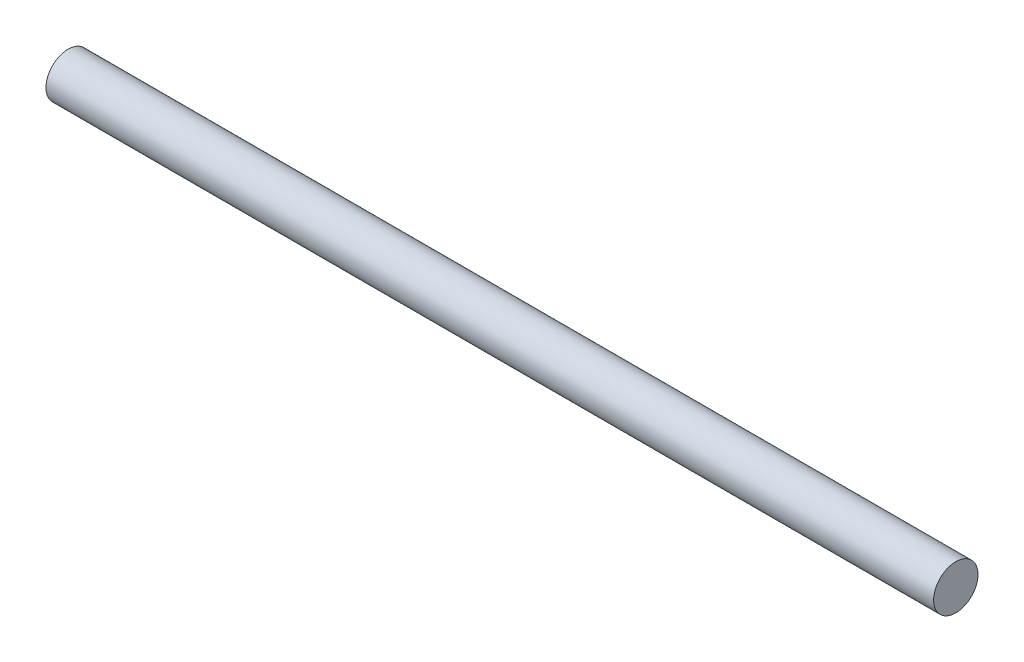
ISO-10303-21;
HEADER;
FILE_DESCRIPTION(('STEP AP214'),'2;1');
FILE_NAME('part.step','',(''),(''),'','','');
FILE_SCHEMA(('AUTOMOTIVE_DESIGN { 1 0 10303 214 1 1 1 1 }'));
ENDSEC;
DATA;
#1=APPLICATION_CONTEXT('core data for automotive mechanical design processes');
#2=APPLICATION_PROTOCOL_DEFINITION('international standard','automotive_design',2000,#1);
#3=PRODUCT_CONTEXT('',#1,'mechanical');
#4=PRODUCT('Part','Part','',(#3));
#5=PRODUCT_RELATED_PRODUCT_CATEGORY('part','',(#4));
#6=PRODUCT_DEFINITION_FORMATION('','',#4);
#7=PRODUCT_DEFINITION_CONTEXT('part definition',#1,'design');
#8=PRODUCT_DEFINITION('design','',#6,#7);
#9=PRODUCT_DEFINITION_SHAPE('','',#8);
#10=(LENGTH_UNIT() NAMED_UNIT(*) SI_UNIT(.MILLI.,.METRE.));
#11=(NAMED_UNIT(*) PLANE_ANGLE_UNIT() SI_UNIT($,.RADIAN.));
#12=(NAMED_UNIT(*) SI_UNIT($,.STERADIAN.) SOLID_ANGLE_UNIT());
#13=UNCERTAINTY_MEASURE_WITH_UNIT(LENGTH_MEASURE(1.E-05),#10,'distance_accuracy_value','');
#14=(GEOMETRIC_REPRESENTATION_CONTEXT(3) GLOBAL_UNCERTAINTY_ASSIGNED_CONTEXT((#13)) GLOBAL_UNIT_ASSIGNED_CONTEXT((#10,
#11,#12)) REPRESENTATION_CONTEXT('',''));
#15=CARTESIAN_POINT('',(0.,0.,0.));
#16=DIRECTION('',(0.,0.,1.));
#17=DIRECTION('',(1.,0.,0.));
#18=AXIS2_PLACEMENT_3D('',#15,#16,#17);
#19=CARTESIAN_POINT('',(254.,0.,0.));
#20=DIRECTION('',(-1.,0.,0.));
#21=DIRECTION('',(0.,0.,1.));
#22=AXIS2_PLACEMENT_3D('',#19,#20,#21);
#23=CYLINDRICAL_SURFACE('',#22,6.35);
#24=CARTESIAN_POINT('',(254.,0.,0.));
#25=DIRECTION('',(1.,0.,0.));
#26=DIRECTION('',(0.,0.,-1.));
#27=AXIS2_PLACEMENT_3D('',#24,#25,#26);
#28=CIRCLE('',#27,6.35);
#29=CARTESIAN_POINT('',(254.,0.,-6.35));
#30=VERTEX_POINT('',#29);
#31=EDGE_CURVE('E10',#30,#30,#28,.T.);
#32=ORIENTED_EDGE('',*,*,#31,.F.);
#33=EDGE_LOOP('',(#32));
#34=FACE_BOUND('',#33,.T.);
#35=CARTESIAN_POINT('',(0.,0.,0.));
#36=DIRECTION('',(1.,0.,0.));
#37=DIRECTION('',(0.,0.,-1.));
#38=AXIS2_PLACEMENT_3D('',#35,#36,#37);
#39=CIRCLE('',#38,6.35);
#40=CARTESIAN_POINT('',(0.,0.,-6.35));
#41=VERTEX_POINT('',#40);
#42=EDGE_CURVE('E42',#41,#41,#39,.T.);
#43=ORIENTED_EDGE('',*,*,#42,.T.);
#44=EDGE_LOOP('',(#43));
#45=FACE_BOUND('',#44,.T.);
#46=ADVANCED_FACE('F39',(#34,#45),#23,.T.);
#47=CARTESIAN_POINT('',(254.,0.,0.));
#48=DIRECTION('',(1.,0.,0.));
#49=DIRECTION('',(0.,0.,-1.));
#50=AXIS2_PLACEMENT_3D('',#47,#48,#49);
#51=PLANE('',#50);
#52=ORIENTED_EDGE('',*,*,#31,.T.);
#53=EDGE_LOOP('',(#52));
#54=FACE_BOUND('',#53,.T.);
#55=ADVANCED_FACE('F54',(#54),#51,.T.);
#56=CARTESIAN_POINT('',(0.,0.,0.));
#57=DIRECTION('',(1.,0.,0.));
#58=DIRECTION('',(0.,0.,-1.));
#59=AXIS2_PLACEMENT_3D('',#56,#57,#58);
#60=PLANE('',#59);
#61=ORIENTED_EDGE('',*,*,#42,.F.);
#62=EDGE_LOOP('',(#61));
#63=FACE_BOUND('',#62,.T.);
#64=ADVANCED_FACE('F52',(#63),#60,.F.);
#65=CLOSED_SHELL('',(#46,#55,#64));
#66=MANIFOLD_SOLID_BREP('B2',#65);
#67=ADVANCED_BREP_SHAPE_REPRESENTATION('',(#18,#66),#14);
#68=SHAPE_DEFINITION_REPRESENTATION(#9,#67);
ENDSEC;
END-ISO-10303-21;
